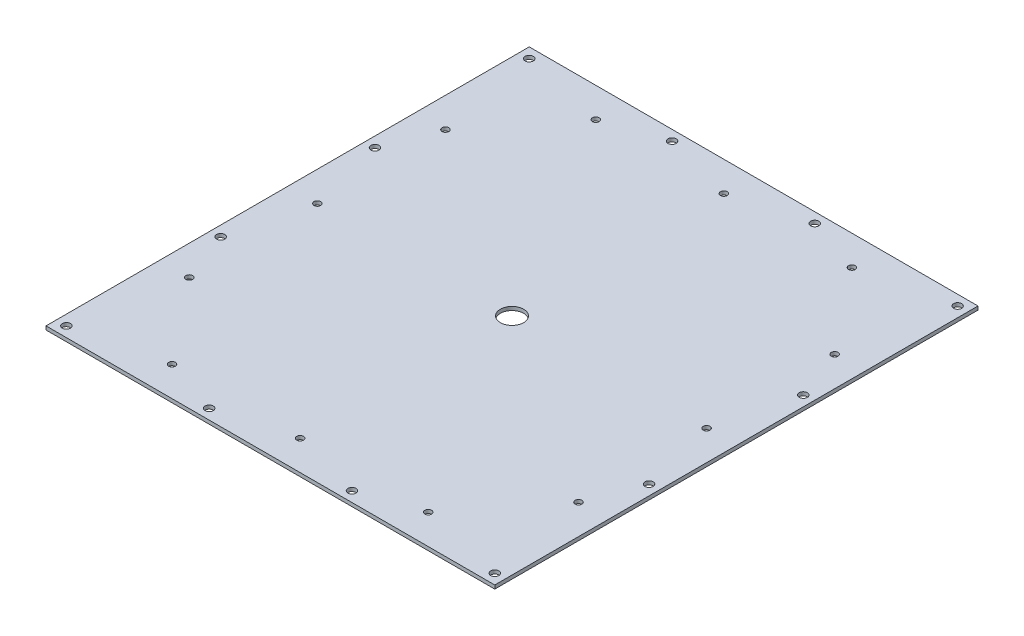
ISO-10303-21;
HEADER;
FILE_DESCRIPTION(('STEP AP214'),'2;1');
FILE_NAME('part.step','',(''),(''),'','','');
FILE_SCHEMA(('AUTOMOTIVE_DESIGN { 1 0 10303 214 1 1 1 1 }'));
ENDSEC;
DATA;
#1=APPLICATION_CONTEXT('core data for automotive mechanical design processes');
#2=APPLICATION_PROTOCOL_DEFINITION('international standard','automotive_design',2000,#1);
#3=PRODUCT_CONTEXT('',#1,'mechanical');
#4=PRODUCT('Part','Part','',(#3));
#5=PRODUCT_RELATED_PRODUCT_CATEGORY('part','',(#4));
#6=PRODUCT_DEFINITION_FORMATION('','',#4);
#7=PRODUCT_DEFINITION_CONTEXT('part definition',#1,'design');
#8=PRODUCT_DEFINITION('design','',#6,#7);
#9=PRODUCT_DEFINITION_SHAPE('','',#8);
#10=(LENGTH_UNIT() NAMED_UNIT(*) SI_UNIT(.MILLI.,.METRE.));
#11=(NAMED_UNIT(*) PLANE_ANGLE_UNIT() SI_UNIT($,.RADIAN.));
#12=(NAMED_UNIT(*) SI_UNIT($,.STERADIAN.) SOLID_ANGLE_UNIT());
#13=UNCERTAINTY_MEASURE_WITH_UNIT(LENGTH_MEASURE(1.E-05),#10,'distance_accuracy_value','');
#14=(GEOMETRIC_REPRESENTATION_CONTEXT(3) GLOBAL_UNCERTAINTY_ASSIGNED_CONTEXT((#13)) GLOBAL_UNIT_ASSIGNED_CONTEXT((#10,
#11,#12)) REPRESENTATION_CONTEXT('',''));
#15=CARTESIAN_POINT('',(0.,0.,0.));
#16=DIRECTION('',(0.,0.,1.));
#17=DIRECTION('',(1.,0.,0.));
#18=AXIS2_PLACEMENT_3D('',#15,#16,#17);
#19=CARTESIAN_POINT('',(0.,1.5748,0.));
#20=DIRECTION('',(0.,1.,0.));
#21=DIRECTION('',(0.,0.,1.));
#22=AXIS2_PLACEMENT_3D('',#19,#20,#21);
#23=PLANE('',#22);
#24=CARTESIAN_POINT('',(173.8884,1.5748,-152.4));
#25=DIRECTION('',(0.,1.,0.));
#26=DIRECTION('',(0.,0.,1.));
#27=AXIS2_PLACEMENT_3D('',#24,#25,#26);
#28=CIRCLE('',#27,1.47320000000001);
#29=CARTESIAN_POINT('',(173.8884,1.5748,-150.9268));
#30=VERTEX_POINT('',#29);
#31=EDGE_CURVE('E254',#30,#30,#28,.T.);
#32=ORIENTED_EDGE('',*,*,#31,.F.);
#33=EDGE_LOOP('',(#32));
#34=FACE_BOUND('',#33,.T.);
#35=CARTESIAN_POINT('',(173.8884,1.5748,-40.64));
#36=DIRECTION('',(0.,1.,0.));
#37=DIRECTION('',(0.,0.,1.));
#38=AXIS2_PLACEMENT_3D('',#35,#36,#37);
#39=CIRCLE('',#38,1.47320000000001);
#40=CARTESIAN_POINT('',(173.8884,1.5748,-39.1668));
#41=VERTEX_POINT('',#40);
#42=EDGE_CURVE('E242',#41,#41,#39,.T.);
#43=ORIENTED_EDGE('',*,*,#42,.F.);
#44=EDGE_LOOP('',(#43));
#45=FACE_BOUND('',#44,.T.);
#46=CARTESIAN_POINT('',(4.0894,1.5748,-96.52));
#47=DIRECTION('',(0.,1.,0.));
#48=DIRECTION('',(0.,0.,1.));
#49=AXIS2_PLACEMENT_3D('',#46,#47,#48);
#50=CIRCLE('',#49,1.4732);
#51=CARTESIAN_POINT('',(4.0894,1.5748,-95.0468));
#52=VERTEX_POINT('',#51);
#53=EDGE_CURVE('E230',#52,#52,#50,.T.);
#54=ORIENTED_EDGE('',*,*,#53,.F.);
#55=EDGE_LOOP('',(#54));
#56=FACE_BOUND('',#55,.T.);
#57=CARTESIAN_POINT('',(144.8816,1.5748,-188.9506));
#58=DIRECTION('',(0.,1.,0.));
#59=DIRECTION('',(0.,0.,1.));
#60=AXIS2_PLACEMENT_3D('',#57,#58,#59);
#61=CIRCLE('',#60,1.47320000000001);
#62=CARTESIAN_POINT('',(144.8816,1.5748,-187.4774));
#63=VERTEX_POINT('',#62);
#64=EDGE_CURVE('E218',#63,#63,#61,.T.);
#65=ORIENTED_EDGE('',*,*,#64,.F.);
#66=EDGE_LOOP('',(#65));
#67=FACE_BOUND('',#66,.T.);
#68=CARTESIAN_POINT('',(33.1216,1.5748,-188.9506));
#69=DIRECTION('',(0.,1.,0.));
#70=DIRECTION('',(0.,0.,1.));
#71=AXIS2_PLACEMENT_3D('',#68,#69,#70);
#72=CIRCLE('',#71,1.4732);
#73=CARTESIAN_POINT('',(33.1216,1.5748,-187.4774));
#74=VERTEX_POINT('',#73);
#75=EDGE_CURVE('E206',#74,#74,#72,.T.);
#76=ORIENTED_EDGE('',*,*,#75,.F.);
#77=EDGE_LOOP('',(#76));
#78=FACE_BOUND('',#77,.T.);
#79=CARTESIAN_POINT('',(89.0016,1.5748,-4.0894));
#80=DIRECTION('',(0.,1.,0.));
#81=DIRECTION('',(0.,0.,1.));
#82=AXIS2_PLACEMENT_3D('',#79,#80,#81);
#83=CIRCLE('',#82,1.47319999999999);
#84=CARTESIAN_POINT('',(89.0016,1.5748,-2.61620000000001));
#85=VERTEX_POINT('',#84);
#86=EDGE_CURVE('E194',#85,#85,#83,.T.);
#87=ORIENTED_EDGE('',*,*,#86,.F.);
#88=EDGE_LOOP('',(#87));
#89=FACE_BOUND('',#88,.T.);
#90=CARTESIAN_POINT('',(182.4482,1.5748,-130.175));
#91=DIRECTION('',(0.,1.,0.));
#92=DIRECTION('',(0.,0.,1.));
#93=AXIS2_PLACEMENT_3D('',#90,#91,#92);
#94=CIRCLE('',#93,1.778);
#95=CARTESIAN_POINT('',(182.4482,1.5748,-128.397));
#96=VERTEX_POINT('',#95);
#97=EDGE_CURVE('E182',#96,#96,#94,.T.);
#98=ORIENTED_EDGE('',*,*,#97,.F.);
#99=EDGE_LOOP('',(#98));
#100=FACE_BOUND('',#99,.T.);
#101=CARTESIAN_POINT('',(182.4482,1.5748,-197.485));
#102=DIRECTION('',(0.,1.,0.));
#103=DIRECTION('',(0.,0.,1.));
#104=AXIS2_PLACEMENT_3D('',#101,#102,#103);
#105=CIRCLE('',#104,1.778);
#106=CARTESIAN_POINT('',(182.4482,1.5748,-195.707));
#107=VERTEX_POINT('',#106);
#108=EDGE_CURVE('E170',#107,#107,#105,.T.);
#109=ORIENTED_EDGE('',*,*,#108,.F.);
#110=EDGE_LOOP('',(#109));
#111=FACE_BOUND('',#110,.T.);
#112=CARTESIAN_POINT('',(120.142,1.5748,4.445));
#113=DIRECTION('',(0.,1.,0.));
#114=DIRECTION('',(0.,0.,1.));
#115=AXIS2_PLACEMENT_3D('',#112,#113,#114);
#116=CIRCLE('',#115,1.778);
#117=CARTESIAN_POINT('',(120.142,1.5748,6.223));
#118=VERTEX_POINT('',#117);
#119=EDGE_CURVE('E158',#118,#118,#116,.T.);
#120=ORIENTED_EDGE('',*,*,#119,.F.);
#121=EDGE_LOOP('',(#120));
#122=FACE_BOUND('',#121,.T.);
#123=CARTESIAN_POINT('',(120.142,1.5748,-197.485));
#124=DIRECTION('',(0.,1.,0.));
#125=DIRECTION('',(0.,0.,1.));
#126=AXIS2_PLACEMENT_3D('',#123,#124,#125);
#127=CIRCLE('',#126,1.778);
#128=CARTESIAN_POINT('',(120.142,1.5748,-195.707));
#129=VERTEX_POINT('',#128);
#130=EDGE_CURVE('E146',#129,#129,#127,.T.);
#131=ORIENTED_EDGE('',*,*,#130,.F.);
#132=EDGE_LOOP('',(#131));
#133=FACE_BOUND('',#132,.T.);
#134=CARTESIAN_POINT('',(-4.445,1.5748,-130.175));
#135=DIRECTION('',(0.,1.,0.));
#136=DIRECTION('',(0.,0.,1.));
#137=AXIS2_PLACEMENT_3D('',#134,#135,#136);
#138=CIRCLE('',#137,1.778);
#139=CARTESIAN_POINT('',(-4.445,1.5748,-128.397));
#140=VERTEX_POINT('',#139);
#141=EDGE_CURVE('E133',#140,#140,#138,.T.);
#142=ORIENTED_EDGE('',*,*,#141,.F.);
#143=EDGE_LOOP('',(#142));
#144=FACE_BOUND('',#143,.T.);
#145=CARTESIAN_POINT('',(-4.445,1.5748,-197.485));
#146=DIRECTION('',(0.,1.,0.));
#147=DIRECTION('',(0.,0.,1.));
#148=AXIS2_PLACEMENT_3D('',#145,#146,#147);
#149=CIRCLE('',#148,1.778);
#150=CARTESIAN_POINT('',(-4.445,1.5748,-195.707));
#151=VERTEX_POINT('',#150);
#152=EDGE_CURVE('E121',#151,#151,#149,.T.);
#153=ORIENTED_EDGE('',*,*,#152,.F.);
#154=EDGE_LOOP('',(#153));
#155=FACE_BOUND('',#154,.T.);
#156=DIRECTION('',(0.,0.,1.));
#157=VECTOR('',#156,1.);
#158=CARTESIAN_POINT('',(-8.89,1.5748,-201.93));
#159=LINE('',#158,#157);
#160=CARTESIAN_POINT('',(-8.89,1.5748,-201.93));
#161=VERTEX_POINT('',#160);
#162=CARTESIAN_POINT('',(-8.89,1.5748,8.89));
#163=VERTEX_POINT('',#162);
#164=EDGE_CURVE('E88',#161,#163,#159,.T.);
#165=ORIENTED_EDGE('',*,*,#164,.T.);
#166=DIRECTION('',(1.,0.,0.));
#167=VECTOR('',#166,1.);
#168=CARTESIAN_POINT('',(-8.89,1.5748,8.89));
#169=LINE('',#168,#167);
#170=CARTESIAN_POINT('',(186.8932,1.5748,8.89));
#171=VERTEX_POINT('',#170);
#172=EDGE_CURVE('E83',#163,#171,#169,.T.);
#173=ORIENTED_EDGE('',*,*,#172,.T.);
#174=DIRECTION('',(0.,0.,-1.));
#175=VECTOR('',#174,1.);
#176=CARTESIAN_POINT('',(186.8932,1.5748,8.89));
#177=LINE('',#176,#175);
#178=CARTESIAN_POINT('',(186.8932,1.5748,-201.93));
#179=VERTEX_POINT('',#178);
#180=EDGE_CURVE('E86',#171,#179,#177,.T.);
#181=ORIENTED_EDGE('',*,*,#180,.T.);
#182=DIRECTION('',(-1.,0.,0.));
#183=VECTOR('',#182,1.);
#184=CARTESIAN_POINT('',(186.8932,1.5748,-201.93));
#185=LINE('',#184,#183);
#186=EDGE_CURVE('E53',#179,#161,#185,.T.);
#187=ORIENTED_EDGE('',*,*,#186,.T.);
#188=EDGE_LOOP('',(#165,#173,#181,#187));
#189=FACE_BOUND('',#188,.T.);
#190=CARTESIAN_POINT('',(-4.445,1.5748,4.445));
#191=DIRECTION('',(0.,1.,0.));
#192=DIRECTION('',(0.,0.,1.));
#193=AXIS2_PLACEMENT_3D('',#190,#191,#192);
#194=CIRCLE('',#193,1.778);
#195=CARTESIAN_POINT('',(-4.445,1.5748,6.223));
#196=VERTEX_POINT('',#195);
#197=EDGE_CURVE('E104',#196,#196,#194,.T.);
#198=ORIENTED_EDGE('',*,*,#197,.F.);
#199=EDGE_LOOP('',(#198));
#200=FACE_BOUND('',#199,.T.);
#201=CARTESIAN_POINT('',(-4.445,1.5748,-62.865));
#202=DIRECTION('',(0.,1.,0.));
#203=DIRECTION('',(0.,0.,1.));
#204=AXIS2_PLACEMENT_3D('',#201,#202,#203);
#205=CIRCLE('',#204,1.778);
#206=CARTESIAN_POINT('',(-4.445,1.5748,-61.087));
#207=VERTEX_POINT('',#206);
#208=EDGE_CURVE('E127',#207,#207,#205,.T.);
#209=ORIENTED_EDGE('',*,*,#208,.F.);
#210=EDGE_LOOP('',(#209));
#211=FACE_BOUND('',#210,.T.);
#212=CARTESIAN_POINT('',(57.8612,1.5748,-197.485));
#213=DIRECTION('',(0.,1.,0.));
#214=DIRECTION('',(0.,0.,1.));
#215=AXIS2_PLACEMENT_3D('',#212,#213,#214);
#216=CIRCLE('',#215,1.778);
#217=CARTESIAN_POINT('',(57.8612,1.5748,-195.707));
#218=VERTEX_POINT('',#217);
#219=EDGE_CURVE('E140',#218,#218,#216,.T.);
#220=ORIENTED_EDGE('',*,*,#219,.F.);
#221=EDGE_LOOP('',(#220));
#222=FACE_BOUND('',#221,.T.);
#223=CARTESIAN_POINT('',(57.8612,1.5748,4.445));
#224=DIRECTION('',(0.,1.,0.));
#225=DIRECTION('',(0.,0.,1.));
#226=AXIS2_PLACEMENT_3D('',#223,#224,#225);
#227=CIRCLE('',#226,1.778);
#228=CARTESIAN_POINT('',(57.8612,1.5748,6.223));
#229=VERTEX_POINT('',#228);
#230=EDGE_CURVE('E152',#229,#229,#227,.T.);
#231=ORIENTED_EDGE('',*,*,#230,.F.);
#232=EDGE_LOOP('',(#231));
#233=FACE_BOUND('',#232,.T.);
#234=CARTESIAN_POINT('',(182.4482,1.5748,4.445));
#235=DIRECTION('',(0.,1.,0.));
#236=DIRECTION('',(0.,0.,1.));
#237=AXIS2_PLACEMENT_3D('',#234,#235,#236);
#238=CIRCLE('',#237,1.778);
#239=CARTESIAN_POINT('',(182.4482,1.5748,6.223));
#240=VERTEX_POINT('',#239);
#241=EDGE_CURVE('E164',#240,#240,#238,.T.);
#242=ORIENTED_EDGE('',*,*,#241,.F.);
#243=EDGE_LOOP('',(#242));
#244=FACE_BOUND('',#243,.T.);
#245=CARTESIAN_POINT('',(182.4482,1.5748,-62.865));
#246=DIRECTION('',(0.,1.,0.));
#247=DIRECTION('',(0.,0.,1.));
#248=AXIS2_PLACEMENT_3D('',#245,#246,#247);
#249=CIRCLE('',#248,1.778);
#250=CARTESIAN_POINT('',(182.4482,1.5748,-61.087));
#251=VERTEX_POINT('',#250);
#252=EDGE_CURVE('E176',#251,#251,#249,.T.);
#253=ORIENTED_EDGE('',*,*,#252,.F.);
#254=EDGE_LOOP('',(#253));
#255=FACE_BOUND('',#254,.T.);
#256=CARTESIAN_POINT('',(33.1216,1.5748,-4.0894));
#257=DIRECTION('',(0.,1.,0.));
#258=DIRECTION('',(0.,0.,1.));
#259=AXIS2_PLACEMENT_3D('',#256,#257,#258);
#260=CIRCLE('',#259,1.4732);
#261=CARTESIAN_POINT('',(33.1216,1.5748,-2.6162));
#262=VERTEX_POINT('',#261);
#263=EDGE_CURVE('E188',#262,#262,#260,.T.);
#264=ORIENTED_EDGE('',*,*,#263,.F.);
#265=EDGE_LOOP('',(#264));
#266=FACE_BOUND('',#265,.T.);
#267=CARTESIAN_POINT('',(144.8816,1.5748,-4.0894));
#268=DIRECTION('',(0.,1.,0.));
#269=DIRECTION('',(0.,0.,1.));
#270=AXIS2_PLACEMENT_3D('',#267,#268,#269);
#271=CIRCLE('',#270,1.47320000000001);
#272=CARTESIAN_POINT('',(144.8816,1.5748,-2.61619999999999));
#273=VERTEX_POINT('',#272);
#274=EDGE_CURVE('E200',#273,#273,#271,.T.);
#275=ORIENTED_EDGE('',*,*,#274,.F.);
#276=EDGE_LOOP('',(#275));
#277=FACE_BOUND('',#276,.T.);
#278=CARTESIAN_POINT('',(89.0016,1.5748,-188.9506));
#279=DIRECTION('',(0.,1.,0.));
#280=DIRECTION('',(0.,0.,1.));
#281=AXIS2_PLACEMENT_3D('',#278,#279,#280);
#282=CIRCLE('',#281,1.47319999999999);
#283=CARTESIAN_POINT('',(89.0016,1.5748,-187.4774));
#284=VERTEX_POINT('',#283);
#285=EDGE_CURVE('E212',#284,#284,#282,.T.);
#286=ORIENTED_EDGE('',*,*,#285,.F.);
#287=EDGE_LOOP('',(#286));
#288=FACE_BOUND('',#287,.T.);
#289=CARTESIAN_POINT('',(4.0894,1.5748,-40.64));
#290=DIRECTION('',(0.,1.,0.));
#291=DIRECTION('',(0.,0.,1.));
#292=AXIS2_PLACEMENT_3D('',#289,#290,#291);
#293=CIRCLE('',#292,1.4732);
#294=CARTESIAN_POINT('',(4.0894,1.5748,-39.1668));
#295=VERTEX_POINT('',#294);
#296=EDGE_CURVE('E224',#295,#295,#293,.T.);
#297=ORIENTED_EDGE('',*,*,#296,.F.);
#298=EDGE_LOOP('',(#297));
#299=FACE_BOUND('',#298,.T.);
#300=CARTESIAN_POINT('',(4.0894,1.5748,-152.4));
#301=DIRECTION('',(0.,1.,0.));
#302=DIRECTION('',(0.,0.,1.));
#303=AXIS2_PLACEMENT_3D('',#300,#301,#302);
#304=CIRCLE('',#303,1.4732);
#305=CARTESIAN_POINT('',(4.0894,1.5748,-150.9268));
#306=VERTEX_POINT('',#305);
#307=EDGE_CURVE('E236',#306,#306,#304,.T.);
#308=ORIENTED_EDGE('',*,*,#307,.F.);
#309=EDGE_LOOP('',(#308));
#310=FACE_BOUND('',#309,.T.);
#311=CARTESIAN_POINT('',(173.8884,1.5748,-96.52));
#312=DIRECTION('',(0.,1.,0.));
#313=DIRECTION('',(0.,0.,1.));
#314=AXIS2_PLACEMENT_3D('',#311,#312,#313);
#315=CIRCLE('',#314,1.47320000000001);
#316=CARTESIAN_POINT('',(173.8884,1.5748,-95.0468));
#317=VERTEX_POINT('',#316);
#318=EDGE_CURVE('E248',#317,#317,#315,.T.);
#319=ORIENTED_EDGE('',*,*,#318,.F.);
#320=EDGE_LOOP('',(#319));
#321=FACE_BOUND('',#320,.T.);
#322=CARTESIAN_POINT('',(89.0016,1.5748,-96.52));
#323=DIRECTION('',(0.,1.,0.));
#324=DIRECTION('',(0.,0.,1.));
#325=AXIS2_PLACEMENT_3D('',#322,#323,#324);
#326=CIRCLE('',#325,5.08);
#327=CARTESIAN_POINT('',(89.0016,1.5748,-91.44));
#328=VERTEX_POINT('',#327);
#329=EDGE_CURVE('E260',#328,#328,#326,.T.);
#330=ORIENTED_EDGE('',*,*,#329,.F.);
#331=EDGE_LOOP('',(#330));
#332=FACE_BOUND('',#331,.T.);
#333=ADVANCED_FACE('F36',(#34,#45,#56,#67,#78,#89,#100,#111,#122,#133,#144,#155,#189,#200,#211,
#222,#233,#244,#255,#266,#277,#288,#299,#310,#321,#332),#23,.T.);
#334=CARTESIAN_POINT('',(0.,0.,0.));
#335=DIRECTION('',(0.,1.,0.));
#336=DIRECTION('',(0.,0.,1.));
#337=AXIS2_PLACEMENT_3D('',#334,#335,#336);
#338=PLANE('',#337);
#339=DIRECTION('',(0.,0.,1.));
#340=VECTOR('',#339,1.);
#341=CARTESIAN_POINT('',(-8.89,0.,-201.93));
#342=LINE('',#341,#340);
#343=CARTESIAN_POINT('',(-8.89,0.,-201.93));
#344=VERTEX_POINT('',#343);
#345=CARTESIAN_POINT('',(-8.89,0.,8.89));
#346=VERTEX_POINT('',#345);
#347=EDGE_CURVE('E100',#344,#346,#342,.T.);
#348=ORIENTED_EDGE('',*,*,#347,.F.);
#349=DIRECTION('',(-1.,0.,0.));
#350=VECTOR('',#349,1.);
#351=CARTESIAN_POINT('',(186.8932,0.,-201.93));
#352=LINE('',#351,#350);
#353=CARTESIAN_POINT('',(186.8932,0.,-201.93));
#354=VERTEX_POINT('',#353);
#355=EDGE_CURVE('E76',#354,#344,#352,.T.);
#356=ORIENTED_EDGE('',*,*,#355,.F.);
#357=DIRECTION('',(0.,0.,-1.));
#358=VECTOR('',#357,1.);
#359=CARTESIAN_POINT('',(186.8932,0.,8.89));
#360=LINE('',#359,#358);
#361=CARTESIAN_POINT('',(186.8932,0.,8.89));
#362=VERTEX_POINT('',#361);
#363=EDGE_CURVE('E70',#362,#354,#360,.T.);
#364=ORIENTED_EDGE('',*,*,#363,.F.);
#365=DIRECTION('',(1.,0.,0.));
#366=VECTOR('',#365,1.);
#367=CARTESIAN_POINT('',(-8.89,0.,8.89));
#368=LINE('',#367,#366);
#369=EDGE_CURVE('E92',#346,#362,#368,.T.);
#370=ORIENTED_EDGE('',*,*,#369,.F.);
#371=EDGE_LOOP('',(#348,#356,#364,#370));
#372=FACE_BOUND('',#371,.T.);
#373=CARTESIAN_POINT('',(-4.445,0.,4.445));
#374=DIRECTION('',(0.,1.,0.));
#375=DIRECTION('',(0.,0.,1.));
#376=AXIS2_PLACEMENT_3D('',#373,#374,#375);
#377=CIRCLE('',#376,1.778);
#378=CARTESIAN_POINT('',(-4.445,0.,6.223));
#379=VERTEX_POINT('',#378);
#380=EDGE_CURVE('E118',#379,#379,#377,.T.);
#381=ORIENTED_EDGE('',*,*,#380,.T.);
#382=EDGE_LOOP('',(#381));
#383=FACE_BOUND('',#382,.T.);
#384=CARTESIAN_POINT('',(-4.445,0.,-197.485));
#385=DIRECTION('',(0.,1.,0.));
#386=DIRECTION('',(0.,0.,1.));
#387=AXIS2_PLACEMENT_3D('',#384,#385,#386);
#388=CIRCLE('',#387,1.778);
#389=CARTESIAN_POINT('',(-4.445,0.,-195.707));
#390=VERTEX_POINT('',#389);
#391=EDGE_CURVE('E124',#390,#390,#388,.T.);
#392=ORIENTED_EDGE('',*,*,#391,.T.);
#393=EDGE_LOOP('',(#392));
#394=FACE_BOUND('',#393,.T.);
#395=CARTESIAN_POINT('',(-4.445,0.,-62.865));
#396=DIRECTION('',(0.,1.,0.));
#397=DIRECTION('',(0.,0.,1.));
#398=AXIS2_PLACEMENT_3D('',#395,#396,#397);
#399=CIRCLE('',#398,1.778);
#400=CARTESIAN_POINT('',(-4.445,0.,-61.087));
#401=VERTEX_POINT('',#400);
#402=EDGE_CURVE('E130',#401,#401,#399,.T.);
#403=ORIENTED_EDGE('',*,*,#402,.T.);
#404=EDGE_LOOP('',(#403));
#405=FACE_BOUND('',#404,.T.);
#406=CARTESIAN_POINT('',(-4.445,0.,-130.175));
#407=DIRECTION('',(0.,1.,0.));
#408=DIRECTION('',(0.,0.,1.));
#409=AXIS2_PLACEMENT_3D('',#406,#407,#408);
#410=CIRCLE('',#409,1.778);
#411=CARTESIAN_POINT('',(-4.445,0.,-128.397));
#412=VERTEX_POINT('',#411);
#413=EDGE_CURVE('E137',#412,#412,#410,.T.);
#414=ORIENTED_EDGE('',*,*,#413,.T.);
#415=EDGE_LOOP('',(#414));
#416=FACE_BOUND('',#415,.T.);
#417=CARTESIAN_POINT('',(57.8612,0.,-197.485));
#418=DIRECTION('',(0.,1.,0.));
#419=DIRECTION('',(0.,0.,1.));
#420=AXIS2_PLACEMENT_3D('',#417,#418,#419);
#421=CIRCLE('',#420,1.778);
#422=CARTESIAN_POINT('',(57.8612,0.,-195.707));
#423=VERTEX_POINT('',#422);
#424=EDGE_CURVE('E143',#423,#423,#421,.T.);
#425=ORIENTED_EDGE('',*,*,#424,.T.);
#426=EDGE_LOOP('',(#425));
#427=FACE_BOUND('',#426,.T.);
#428=CARTESIAN_POINT('',(120.142,0.,-197.485));
#429=DIRECTION('',(0.,1.,0.));
#430=DIRECTION('',(0.,0.,1.));
#431=AXIS2_PLACEMENT_3D('',#428,#429,#430);
#432=CIRCLE('',#431,1.778);
#433=CARTESIAN_POINT('',(120.142,0.,-195.707));
#434=VERTEX_POINT('',#433);
#435=EDGE_CURVE('E149',#434,#434,#432,.T.);
#436=ORIENTED_EDGE('',*,*,#435,.T.);
#437=EDGE_LOOP('',(#436));
#438=FACE_BOUND('',#437,.T.);
#439=CARTESIAN_POINT('',(57.8612,0.,4.445));
#440=DIRECTION('',(0.,1.,0.));
#441=DIRECTION('',(0.,0.,1.));
#442=AXIS2_PLACEMENT_3D('',#439,#440,#441);
#443=CIRCLE('',#442,1.778);
#444=CARTESIAN_POINT('',(57.8612,0.,6.223));
#445=VERTEX_POINT('',#444);
#446=EDGE_CURVE('E155',#445,#445,#443,.T.);
#447=ORIENTED_EDGE('',*,*,#446,.T.);
#448=EDGE_LOOP('',(#447));
#449=FACE_BOUND('',#448,.T.);
#450=CARTESIAN_POINT('',(120.142,0.,4.445));
#451=DIRECTION('',(0.,1.,0.));
#452=DIRECTION('',(0.,0.,1.));
#453=AXIS2_PLACEMENT_3D('',#450,#451,#452);
#454=CIRCLE('',#453,1.778);
#455=CARTESIAN_POINT('',(120.142,0.,6.223));
#456=VERTEX_POINT('',#455);
#457=EDGE_CURVE('E161',#456,#456,#454,.T.);
#458=ORIENTED_EDGE('',*,*,#457,.T.);
#459=EDGE_LOOP('',(#458));
#460=FACE_BOUND('',#459,.T.);
#461=CARTESIAN_POINT('',(182.4482,0.,4.445));
#462=DIRECTION('',(0.,1.,0.));
#463=DIRECTION('',(0.,0.,1.));
#464=AXIS2_PLACEMENT_3D('',#461,#462,#463);
#465=CIRCLE('',#464,1.778);
#466=CARTESIAN_POINT('',(182.4482,0.,6.223));
#467=VERTEX_POINT('',#466);
#468=EDGE_CURVE('E167',#467,#467,#465,.T.);
#469=ORIENTED_EDGE('',*,*,#468,.T.);
#470=EDGE_LOOP('',(#469));
#471=FACE_BOUND('',#470,.T.);
#472=CARTESIAN_POINT('',(182.4482,0.,-197.485));
#473=DIRECTION('',(0.,1.,0.));
#474=DIRECTION('',(0.,0.,1.));
#475=AXIS2_PLACEMENT_3D('',#472,#473,#474);
#476=CIRCLE('',#475,1.778);
#477=CARTESIAN_POINT('',(182.4482,0.,-195.707));
#478=VERTEX_POINT('',#477);
#479=EDGE_CURVE('E173',#478,#478,#476,.T.);
#480=ORIENTED_EDGE('',*,*,#479,.T.);
#481=EDGE_LOOP('',(#480));
#482=FACE_BOUND('',#481,.T.);
#483=CARTESIAN_POINT('',(182.4482,0.,-62.865));
#484=DIRECTION('',(0.,1.,0.));
#485=DIRECTION('',(0.,0.,1.));
#486=AXIS2_PLACEMENT_3D('',#483,#484,#485);
#487=CIRCLE('',#486,1.778);
#488=CARTESIAN_POINT('',(182.4482,0.,-61.087));
#489=VERTEX_POINT('',#488);
#490=EDGE_CURVE('E179',#489,#489,#487,.T.);
#491=ORIENTED_EDGE('',*,*,#490,.T.);
#492=EDGE_LOOP('',(#491));
#493=FACE_BOUND('',#492,.T.);
#494=CARTESIAN_POINT('',(182.4482,0.,-130.175));
#495=DIRECTION('',(0.,1.,0.));
#496=DIRECTION('',(0.,0.,1.));
#497=AXIS2_PLACEMENT_3D('',#494,#495,#496);
#498=CIRCLE('',#497,1.778);
#499=CARTESIAN_POINT('',(182.4482,0.,-128.397));
#500=VERTEX_POINT('',#499);
#501=EDGE_CURVE('E185',#500,#500,#498,.T.);
#502=ORIENTED_EDGE('',*,*,#501,.T.);
#503=EDGE_LOOP('',(#502));
#504=FACE_BOUND('',#503,.T.);
#505=CARTESIAN_POINT('',(33.1216,0.,-4.0894));
#506=DIRECTION('',(0.,1.,0.));
#507=DIRECTION('',(0.,0.,1.));
#508=AXIS2_PLACEMENT_3D('',#505,#506,#507);
#509=CIRCLE('',#508,1.4732);
#510=CARTESIAN_POINT('',(33.1216,0.,-2.6162));
#511=VERTEX_POINT('',#510);
#512=EDGE_CURVE('E191',#511,#511,#509,.T.);
#513=ORIENTED_EDGE('',*,*,#512,.T.);
#514=EDGE_LOOP('',(#513));
#515=FACE_BOUND('',#514,.T.);
#516=CARTESIAN_POINT('',(89.0016,0.,-4.0894));
#517=DIRECTION('',(0.,1.,0.));
#518=DIRECTION('',(0.,0.,1.));
#519=AXIS2_PLACEMENT_3D('',#516,#517,#518);
#520=CIRCLE('',#519,1.47319999999999);
#521=CARTESIAN_POINT('',(89.0016,0.,-2.61620000000001));
#522=VERTEX_POINT('',#521);
#523=EDGE_CURVE('E197',#522,#522,#520,.T.);
#524=ORIENTED_EDGE('',*,*,#523,.T.);
#525=EDGE_LOOP('',(#524));
#526=FACE_BOUND('',#525,.T.);
#527=CARTESIAN_POINT('',(144.8816,0.,-4.0894));
#528=DIRECTION('',(0.,1.,0.));
#529=DIRECTION('',(0.,0.,1.));
#530=AXIS2_PLACEMENT_3D('',#527,#528,#529);
#531=CIRCLE('',#530,1.47320000000001);
#532=CARTESIAN_POINT('',(144.8816,0.,-2.61619999999999));
#533=VERTEX_POINT('',#532);
#534=EDGE_CURVE('E203',#533,#533,#531,.T.);
#535=ORIENTED_EDGE('',*,*,#534,.T.);
#536=EDGE_LOOP('',(#535));
#537=FACE_BOUND('',#536,.T.);
#538=CARTESIAN_POINT('',(33.1216,0.,-188.9506));
#539=DIRECTION('',(0.,1.,0.));
#540=DIRECTION('',(0.,0.,1.));
#541=AXIS2_PLACEMENT_3D('',#538,#539,#540);
#542=CIRCLE('',#541,1.4732);
#543=CARTESIAN_POINT('',(33.1216,0.,-187.4774));
#544=VERTEX_POINT('',#543);
#545=EDGE_CURVE('E209',#544,#544,#542,.T.);
#546=ORIENTED_EDGE('',*,*,#545,.T.);
#547=EDGE_LOOP('',(#546));
#548=FACE_BOUND('',#547,.T.);
#549=CARTESIAN_POINT('',(89.0016,0.,-188.9506));
#550=DIRECTION('',(0.,1.,0.));
#551=DIRECTION('',(0.,0.,1.));
#552=AXIS2_PLACEMENT_3D('',#549,#550,#551);
#553=CIRCLE('',#552,1.47319999999999);
#554=CARTESIAN_POINT('',(89.0016,0.,-187.4774));
#555=VERTEX_POINT('',#554);
#556=EDGE_CURVE('E215',#555,#555,#553,.T.);
#557=ORIENTED_EDGE('',*,*,#556,.T.);
#558=EDGE_LOOP('',(#557));
#559=FACE_BOUND('',#558,.T.);
#560=CARTESIAN_POINT('',(144.8816,0.,-188.9506));
#561=DIRECTION('',(0.,1.,0.));
#562=DIRECTION('',(0.,0.,1.));
#563=AXIS2_PLACEMENT_3D('',#560,#561,#562);
#564=CIRCLE('',#563,1.47320000000001);
#565=CARTESIAN_POINT('',(144.8816,0.,-187.4774));
#566=VERTEX_POINT('',#565);
#567=EDGE_CURVE('E221',#566,#566,#564,.T.);
#568=ORIENTED_EDGE('',*,*,#567,.T.);
#569=EDGE_LOOP('',(#568));
#570=FACE_BOUND('',#569,.T.);
#571=CARTESIAN_POINT('',(4.0894,0.,-40.64));
#572=DIRECTION('',(0.,1.,0.));
#573=DIRECTION('',(0.,0.,1.));
#574=AXIS2_PLACEMENT_3D('',#571,#572,#573);
#575=CIRCLE('',#574,1.4732);
#576=CARTESIAN_POINT('',(4.0894,0.,-39.1668));
#577=VERTEX_POINT('',#576);
#578=EDGE_CURVE('E227',#577,#577,#575,.T.);
#579=ORIENTED_EDGE('',*,*,#578,.T.);
#580=EDGE_LOOP('',(#579));
#581=FACE_BOUND('',#580,.T.);
#582=CARTESIAN_POINT('',(4.0894,0.,-96.52));
#583=DIRECTION('',(0.,1.,0.));
#584=DIRECTION('',(0.,0.,1.));
#585=AXIS2_PLACEMENT_3D('',#582,#583,#584);
#586=CIRCLE('',#585,1.4732);
#587=CARTESIAN_POINT('',(4.0894,0.,-95.0468));
#588=VERTEX_POINT('',#587);
#589=EDGE_CURVE('E233',#588,#588,#586,.T.);
#590=ORIENTED_EDGE('',*,*,#589,.T.);
#591=EDGE_LOOP('',(#590));
#592=FACE_BOUND('',#591,.T.);
#593=CARTESIAN_POINT('',(4.0894,0.,-152.4));
#594=DIRECTION('',(0.,1.,0.));
#595=DIRECTION('',(0.,0.,1.));
#596=AXIS2_PLACEMENT_3D('',#593,#594,#595);
#597=CIRCLE('',#596,1.4732);
#598=CARTESIAN_POINT('',(4.0894,0.,-150.9268));
#599=VERTEX_POINT('',#598);
#600=EDGE_CURVE('E239',#599,#599,#597,.T.);
#601=ORIENTED_EDGE('',*,*,#600,.T.);
#602=EDGE_LOOP('',(#601));
#603=FACE_BOUND('',#602,.T.);
#604=CARTESIAN_POINT('',(173.8884,0.,-40.64));
#605=DIRECTION('',(0.,1.,0.));
#606=DIRECTION('',(0.,0.,1.));
#607=AXIS2_PLACEMENT_3D('',#604,#605,#606);
#608=CIRCLE('',#607,1.47320000000001);
#609=CARTESIAN_POINT('',(173.8884,0.,-39.1668));
#610=VERTEX_POINT('',#609);
#611=EDGE_CURVE('E245',#610,#610,#608,.T.);
#612=ORIENTED_EDGE('',*,*,#611,.T.);
#613=EDGE_LOOP('',(#612));
#614=FACE_BOUND('',#613,.T.);
#615=CARTESIAN_POINT('',(173.8884,0.,-96.52));
#616=DIRECTION('',(0.,1.,0.));
#617=DIRECTION('',(0.,0.,1.));
#618=AXIS2_PLACEMENT_3D('',#615,#616,#617);
#619=CIRCLE('',#618,1.47320000000001);
#620=CARTESIAN_POINT('',(173.8884,0.,-95.0468));
#621=VERTEX_POINT('',#620);
#622=EDGE_CURVE('E251',#621,#621,#619,.T.);
#623=ORIENTED_EDGE('',*,*,#622,.T.);
#624=EDGE_LOOP('',(#623));
#625=FACE_BOUND('',#624,.T.);
#626=CARTESIAN_POINT('',(173.8884,0.,-152.4));
#627=DIRECTION('',(0.,1.,0.));
#628=DIRECTION('',(0.,0.,1.));
#629=AXIS2_PLACEMENT_3D('',#626,#627,#628);
#630=CIRCLE('',#629,1.47320000000001);
#631=CARTESIAN_POINT('',(173.8884,0.,-150.9268));
#632=VERTEX_POINT('',#631);
#633=EDGE_CURVE('E257',#632,#632,#630,.T.);
#634=ORIENTED_EDGE('',*,*,#633,.T.);
#635=EDGE_LOOP('',(#634));
#636=FACE_BOUND('',#635,.T.);
#637=CARTESIAN_POINT('',(89.0016,0.,-96.52));
#638=DIRECTION('',(0.,1.,0.));
#639=DIRECTION('',(0.,0.,1.));
#640=AXIS2_PLACEMENT_3D('',#637,#638,#639);
#641=CIRCLE('',#640,5.08);
#642=CARTESIAN_POINT('',(89.0016,0.,-91.44));
#643=VERTEX_POINT('',#642);
#644=EDGE_CURVE('E263',#643,#643,#641,.T.);
#645=ORIENTED_EDGE('',*,*,#644,.T.);
#646=EDGE_LOOP('',(#645));
#647=FACE_BOUND('',#646,.T.);
#648=ADVANCED_FACE('F112',(#372,#383,#394,#405,#416,#427,#438,#449,#460,#471,#482,#493,#504,
#515,#526,#537,#548,#559,#570,#581,#592,#603,#614,#625,#636,#647),#338,.F.);
#649=CARTESIAN_POINT('',(-8.89,1.5748,-201.93));
#650=DIRECTION('',(1.,0.,0.));
#651=DIRECTION('',(0.,0.,-1.));
#652=AXIS2_PLACEMENT_3D('',#649,#650,#651);
#653=PLANE('',#652);
#654=ORIENTED_EDGE('',*,*,#347,.T.);
#655=DIRECTION('',(0.,-1.,0.));
#656=VECTOR('',#655,1.);
#657=CARTESIAN_POINT('',(-8.89,1.5748,8.89));
#658=LINE('',#657,#656);
#659=EDGE_CURVE('E11',#163,#346,#658,.T.);
#660=ORIENTED_EDGE('',*,*,#659,.F.);
#661=ORIENTED_EDGE('',*,*,#164,.F.);
#662=DIRECTION('',(0.,-1.,0.));
#663=VECTOR('',#662,1.);
#664=CARTESIAN_POINT('',(-8.89,1.5748,-201.93));
#665=LINE('',#664,#663);
#666=EDGE_CURVE('E96',#161,#344,#665,.T.);
#667=ORIENTED_EDGE('',*,*,#666,.T.);
#668=EDGE_LOOP('',(#654,#660,#661,#667));
#669=FACE_BOUND('',#668,.T.);
#670=ADVANCED_FACE('F38',(#669),#653,.F.);
#671=CARTESIAN_POINT('',(-8.89,1.5748,8.89));
#672=DIRECTION('',(0.,0.,-1.));
#673=DIRECTION('',(-1.,0.,0.));
#674=AXIS2_PLACEMENT_3D('',#671,#672,#673);
#675=PLANE('',#674);
#676=ORIENTED_EDGE('',*,*,#369,.T.);
#677=DIRECTION('',(0.,-1.,0.));
#678=VECTOR('',#677,1.);
#679=CARTESIAN_POINT('',(186.8932,1.5748,8.89));
#680=LINE('',#679,#678);
#681=EDGE_CURVE('E45',#171,#362,#680,.T.);
#682=ORIENTED_EDGE('',*,*,#681,.F.);
#683=ORIENTED_EDGE('',*,*,#172,.F.);
#684=ORIENTED_EDGE('',*,*,#659,.T.);
#685=EDGE_LOOP('',(#676,#682,#683,#684));
#686=FACE_BOUND('',#685,.T.);
#687=ADVANCED_FACE('F91',(#686),#675,.F.);
#688=CARTESIAN_POINT('',(186.8932,1.5748,8.89));
#689=DIRECTION('',(-1.,0.,0.));
#690=DIRECTION('',(0.,0.,1.));
#691=AXIS2_PLACEMENT_3D('',#688,#689,#690);
#692=PLANE('',#691);
#693=ORIENTED_EDGE('',*,*,#363,.T.);
#694=DIRECTION('',(0.,-1.,0.));
#695=VECTOR('',#694,1.);
#696=CARTESIAN_POINT('',(186.8932,1.5748,-201.93));
#697=LINE('',#696,#695);
#698=EDGE_CURVE('E93',#179,#354,#697,.T.);
#699=ORIENTED_EDGE('',*,*,#698,.F.);
#700=ORIENTED_EDGE('',*,*,#180,.F.);
#701=ORIENTED_EDGE('',*,*,#681,.T.);
#702=EDGE_LOOP('',(#693,#699,#700,#701));
#703=FACE_BOUND('',#702,.T.);
#704=ADVANCED_FACE('F94',(#703),#692,.F.);
#705=CARTESIAN_POINT('',(186.8932,1.5748,-201.93));
#706=DIRECTION('',(0.,0.,1.));
#707=DIRECTION('',(1.,0.,0.));
#708=AXIS2_PLACEMENT_3D('',#705,#706,#707);
#709=PLANE('',#708);
#710=ORIENTED_EDGE('',*,*,#355,.T.);
#711=ORIENTED_EDGE('',*,*,#666,.F.);
#712=ORIENTED_EDGE('',*,*,#186,.F.);
#713=ORIENTED_EDGE('',*,*,#698,.T.);
#714=EDGE_LOOP('',(#710,#711,#712,#713));
#715=FACE_BOUND('',#714,.T.);
#716=ADVANCED_FACE('F109',(#715),#709,.F.);
#717=CARTESIAN_POINT('',(-4.445,1.5748,4.445));
#718=DIRECTION('',(0.,-1.,0.));
#719=DIRECTION('',(0.,0.,-1.));
#720=AXIS2_PLACEMENT_3D('',#717,#718,#719);
#721=CYLINDRICAL_SURFACE('',#720,1.778);
#722=ORIENTED_EDGE('',*,*,#197,.T.);
#723=EDGE_LOOP('',(#722));
#724=FACE_BOUND('',#723,.T.);
#725=ORIENTED_EDGE('',*,*,#380,.F.);
#726=EDGE_LOOP('',(#725));
#727=FACE_BOUND('',#726,.T.);
#728=ADVANCED_FACE('F284',(#724,#727),#721,.F.);
#729=CARTESIAN_POINT('',(-4.445,1.5748,-197.485));
#730=DIRECTION('',(0.,-1.,0.));
#731=DIRECTION('',(0.,0.,-1.));
#732=AXIS2_PLACEMENT_3D('',#729,#730,#731);
#733=CYLINDRICAL_SURFACE('',#732,1.778);
#734=ORIENTED_EDGE('',*,*,#152,.T.);
#735=EDGE_LOOP('',(#734));
#736=FACE_BOUND('',#735,.T.);
#737=ORIENTED_EDGE('',*,*,#391,.F.);
#738=EDGE_LOOP('',(#737));
#739=FACE_BOUND('',#738,.T.);
#740=ADVANCED_FACE('F332',(#736,#739),#733,.F.);
#741=CARTESIAN_POINT('',(-4.445,1.5748,-62.865));
#742=DIRECTION('',(0.,-1.,0.));
#743=DIRECTION('',(0.,0.,-1.));
#744=AXIS2_PLACEMENT_3D('',#741,#742,#743);
#745=CYLINDRICAL_SURFACE('',#744,1.778);
#746=ORIENTED_EDGE('',*,*,#208,.T.);
#747=EDGE_LOOP('',(#746));
#748=FACE_BOUND('',#747,.T.);
#749=ORIENTED_EDGE('',*,*,#402,.F.);
#750=EDGE_LOOP('',(#749));
#751=FACE_BOUND('',#750,.T.);
#752=ADVANCED_FACE('F340',(#748,#751),#745,.F.);
#753=CARTESIAN_POINT('',(-4.445,1.5748,-130.175));
#754=DIRECTION('',(0.,-1.,0.));
#755=DIRECTION('',(0.,0.,-1.));
#756=AXIS2_PLACEMENT_3D('',#753,#754,#755);
#757=CYLINDRICAL_SURFACE('',#756,1.778);
#758=ORIENTED_EDGE('',*,*,#141,.T.);
#759=EDGE_LOOP('',(#758));
#760=FACE_BOUND('',#759,.T.);
#761=ORIENTED_EDGE('',*,*,#413,.F.);
#762=EDGE_LOOP('',(#761));
#763=FACE_BOUND('',#762,.T.);
#764=ADVANCED_FACE('F348',(#760,#763),#757,.F.);
#765=CARTESIAN_POINT('',(57.8612,1.5748,-197.485));
#766=DIRECTION('',(0.,-1.,0.));
#767=DIRECTION('',(0.,0.,-1.));
#768=AXIS2_PLACEMENT_3D('',#765,#766,#767);
#769=CYLINDRICAL_SURFACE('',#768,1.778);
#770=ORIENTED_EDGE('',*,*,#219,.T.);
#771=EDGE_LOOP('',(#770));
#772=FACE_BOUND('',#771,.T.);
#773=ORIENTED_EDGE('',*,*,#424,.F.);
#774=EDGE_LOOP('',(#773));
#775=FACE_BOUND('',#774,.T.);
#776=ADVANCED_FACE('F357',(#772,#775),#769,.F.);
#777=CARTESIAN_POINT('',(120.142,1.5748,-197.485));
#778=DIRECTION('',(0.,-1.,0.));
#779=DIRECTION('',(0.,0.,-1.));
#780=AXIS2_PLACEMENT_3D('',#777,#778,#779);
#781=CYLINDRICAL_SURFACE('',#780,1.778);
#782=ORIENTED_EDGE('',*,*,#130,.T.);
#783=EDGE_LOOP('',(#782));
#784=FACE_BOUND('',#783,.T.);
#785=ORIENTED_EDGE('',*,*,#435,.F.);
#786=EDGE_LOOP('',(#785));
#787=FACE_BOUND('',#786,.T.);
#788=ADVANCED_FACE('F366',(#784,#787),#781,.F.);
#789=CARTESIAN_POINT('',(57.8612,1.5748,4.445));
#790=DIRECTION('',(0.,-1.,0.));
#791=DIRECTION('',(0.,0.,-1.));
#792=AXIS2_PLACEMENT_3D('',#789,#790,#791);
#793=CYLINDRICAL_SURFACE('',#792,1.778);
#794=ORIENTED_EDGE('',*,*,#230,.T.);
#795=EDGE_LOOP('',(#794));
#796=FACE_BOUND('',#795,.T.);
#797=ORIENTED_EDGE('',*,*,#446,.F.);
#798=EDGE_LOOP('',(#797));
#799=FACE_BOUND('',#798,.T.);
#800=ADVANCED_FACE('F375',(#796,#799),#793,.F.);
#801=CARTESIAN_POINT('',(120.142,1.5748,4.445));
#802=DIRECTION('',(0.,-1.,0.));
#803=DIRECTION('',(0.,0.,-1.));
#804=AXIS2_PLACEMENT_3D('',#801,#802,#803);
#805=CYLINDRICAL_SURFACE('',#804,1.778);
#806=ORIENTED_EDGE('',*,*,#119,.T.);
#807=EDGE_LOOP('',(#806));
#808=FACE_BOUND('',#807,.T.);
#809=ORIENTED_EDGE('',*,*,#457,.F.);
#810=EDGE_LOOP('',(#809));
#811=FACE_BOUND('',#810,.T.);
#812=ADVANCED_FACE('F384',(#808,#811),#805,.F.);
#813=CARTESIAN_POINT('',(182.4482,1.5748,4.445));
#814=DIRECTION('',(0.,-1.,0.));
#815=DIRECTION('',(0.,0.,-1.));
#816=AXIS2_PLACEMENT_3D('',#813,#814,#815);
#817=CYLINDRICAL_SURFACE('',#816,1.778);
#818=ORIENTED_EDGE('',*,*,#241,.T.);
#819=EDGE_LOOP('',(#818));
#820=FACE_BOUND('',#819,.T.);
#821=ORIENTED_EDGE('',*,*,#468,.F.);
#822=EDGE_LOOP('',(#821));
#823=FACE_BOUND('',#822,.T.);
#824=ADVANCED_FACE('F393',(#820,#823),#817,.F.);
#825=CARTESIAN_POINT('',(182.4482,1.5748,-197.485));
#826=DIRECTION('',(0.,-1.,0.));
#827=DIRECTION('',(0.,0.,-1.));
#828=AXIS2_PLACEMENT_3D('',#825,#826,#827);
#829=CYLINDRICAL_SURFACE('',#828,1.778);
#830=ORIENTED_EDGE('',*,*,#108,.T.);
#831=EDGE_LOOP('',(#830));
#832=FACE_BOUND('',#831,.T.);
#833=ORIENTED_EDGE('',*,*,#479,.F.);
#834=EDGE_LOOP('',(#833));
#835=FACE_BOUND('',#834,.T.);
#836=ADVANCED_FACE('F402',(#832,#835),#829,.F.);
#837=CARTESIAN_POINT('',(182.4482,1.5748,-62.865));
#838=DIRECTION('',(0.,-1.,0.));
#839=DIRECTION('',(0.,0.,-1.));
#840=AXIS2_PLACEMENT_3D('',#837,#838,#839);
#841=CYLINDRICAL_SURFACE('',#840,1.778);
#842=ORIENTED_EDGE('',*,*,#252,.T.);
#843=EDGE_LOOP('',(#842));
#844=FACE_BOUND('',#843,.T.);
#845=ORIENTED_EDGE('',*,*,#490,.F.);
#846=EDGE_LOOP('',(#845));
#847=FACE_BOUND('',#846,.T.);
#848=ADVANCED_FACE('F411',(#844,#847),#841,.F.);
#849=CARTESIAN_POINT('',(182.4482,1.5748,-130.175));
#850=DIRECTION('',(0.,-1.,0.));
#851=DIRECTION('',(0.,0.,-1.));
#852=AXIS2_PLACEMENT_3D('',#849,#850,#851);
#853=CYLINDRICAL_SURFACE('',#852,1.778);
#854=ORIENTED_EDGE('',*,*,#97,.T.);
#855=EDGE_LOOP('',(#854));
#856=FACE_BOUND('',#855,.T.);
#857=ORIENTED_EDGE('',*,*,#501,.F.);
#858=EDGE_LOOP('',(#857));
#859=FACE_BOUND('',#858,.T.);
#860=ADVANCED_FACE('F420',(#856,#859),#853,.F.);
#861=CARTESIAN_POINT('',(33.1216,1.5748,-4.0894));
#862=DIRECTION('',(0.,-1.,0.));
#863=DIRECTION('',(0.,0.,-1.));
#864=AXIS2_PLACEMENT_3D('',#861,#862,#863);
#865=CYLINDRICAL_SURFACE('',#864,1.4732);
#866=ORIENTED_EDGE('',*,*,#263,.T.);
#867=EDGE_LOOP('',(#866));
#868=FACE_BOUND('',#867,.T.);
#869=ORIENTED_EDGE('',*,*,#512,.F.);
#870=EDGE_LOOP('',(#869));
#871=FACE_BOUND('',#870,.T.);
#872=ADVANCED_FACE('F429',(#868,#871),#865,.F.);
#873=CARTESIAN_POINT('',(89.0016,1.5748,-4.0894));
#874=DIRECTION('',(0.,-1.,0.));
#875=DIRECTION('',(0.,0.,-1.));
#876=AXIS2_PLACEMENT_3D('',#873,#874,#875);
#877=CYLINDRICAL_SURFACE('',#876,1.47319999999999);
#878=ORIENTED_EDGE('',*,*,#86,.T.);
#879=EDGE_LOOP('',(#878));
#880=FACE_BOUND('',#879,.T.);
#881=ORIENTED_EDGE('',*,*,#523,.F.);
#882=EDGE_LOOP('',(#881));
#883=FACE_BOUND('',#882,.T.);
#884=ADVANCED_FACE('F438',(#880,#883),#877,.F.);
#885=CARTESIAN_POINT('',(144.8816,1.5748,-4.0894));
#886=DIRECTION('',(0.,-1.,0.));
#887=DIRECTION('',(0.,0.,-1.));
#888=AXIS2_PLACEMENT_3D('',#885,#886,#887);
#889=CYLINDRICAL_SURFACE('',#888,1.47320000000001);
#890=ORIENTED_EDGE('',*,*,#274,.T.);
#891=EDGE_LOOP('',(#890));
#892=FACE_BOUND('',#891,.T.);
#893=ORIENTED_EDGE('',*,*,#534,.F.);
#894=EDGE_LOOP('',(#893));
#895=FACE_BOUND('',#894,.T.);
#896=ADVANCED_FACE('F447',(#892,#895),#889,.F.);
#897=CARTESIAN_POINT('',(33.1216,1.5748,-188.9506));
#898=DIRECTION('',(0.,-1.,0.));
#899=DIRECTION('',(0.,0.,-1.));
#900=AXIS2_PLACEMENT_3D('',#897,#898,#899);
#901=CYLINDRICAL_SURFACE('',#900,1.4732);
#902=ORIENTED_EDGE('',*,*,#75,.T.);
#903=EDGE_LOOP('',(#902));
#904=FACE_BOUND('',#903,.T.);
#905=ORIENTED_EDGE('',*,*,#545,.F.);
#906=EDGE_LOOP('',(#905));
#907=FACE_BOUND('',#906,.T.);
#908=ADVANCED_FACE('F456',(#904,#907),#901,.F.);
#909=CARTESIAN_POINT('',(89.0016,1.5748,-188.9506));
#910=DIRECTION('',(0.,-1.,0.));
#911=DIRECTION('',(0.,0.,-1.));
#912=AXIS2_PLACEMENT_3D('',#909,#910,#911);
#913=CYLINDRICAL_SURFACE('',#912,1.47319999999999);
#914=ORIENTED_EDGE('',*,*,#285,.T.);
#915=EDGE_LOOP('',(#914));
#916=FACE_BOUND('',#915,.T.);
#917=ORIENTED_EDGE('',*,*,#556,.F.);
#918=EDGE_LOOP('',(#917));
#919=FACE_BOUND('',#918,.T.);
#920=ADVANCED_FACE('F465',(#916,#919),#913,.F.);
#921=CARTESIAN_POINT('',(144.8816,1.5748,-188.9506));
#922=DIRECTION('',(0.,-1.,0.));
#923=DIRECTION('',(0.,0.,-1.));
#924=AXIS2_PLACEMENT_3D('',#921,#922,#923);
#925=CYLINDRICAL_SURFACE('',#924,1.47320000000001);
#926=ORIENTED_EDGE('',*,*,#64,.T.);
#927=EDGE_LOOP('',(#926));
#928=FACE_BOUND('',#927,.T.);
#929=ORIENTED_EDGE('',*,*,#567,.F.);
#930=EDGE_LOOP('',(#929));
#931=FACE_BOUND('',#930,.T.);
#932=ADVANCED_FACE('F474',(#928,#931),#925,.F.);
#933=CARTESIAN_POINT('',(4.0894,1.5748,-40.64));
#934=DIRECTION('',(0.,-1.,0.));
#935=DIRECTION('',(0.,0.,-1.));
#936=AXIS2_PLACEMENT_3D('',#933,#934,#935);
#937=CYLINDRICAL_SURFACE('',#936,1.4732);
#938=ORIENTED_EDGE('',*,*,#296,.T.);
#939=EDGE_LOOP('',(#938));
#940=FACE_BOUND('',#939,.T.);
#941=ORIENTED_EDGE('',*,*,#578,.F.);
#942=EDGE_LOOP('',(#941));
#943=FACE_BOUND('',#942,.T.);
#944=ADVANCED_FACE('F483',(#940,#943),#937,.F.);
#945=CARTESIAN_POINT('',(4.0894,1.5748,-96.52));
#946=DIRECTION('',(0.,-1.,0.));
#947=DIRECTION('',(0.,0.,-1.));
#948=AXIS2_PLACEMENT_3D('',#945,#946,#947);
#949=CYLINDRICAL_SURFACE('',#948,1.4732);
#950=ORIENTED_EDGE('',*,*,#53,.T.);
#951=EDGE_LOOP('',(#950));
#952=FACE_BOUND('',#951,.T.);
#953=ORIENTED_EDGE('',*,*,#589,.F.);
#954=EDGE_LOOP('',(#953));
#955=FACE_BOUND('',#954,.T.);
#956=ADVANCED_FACE('F492',(#952,#955),#949,.F.);
#957=CARTESIAN_POINT('',(4.0894,1.5748,-152.4));
#958=DIRECTION('',(0.,-1.,0.));
#959=DIRECTION('',(0.,0.,-1.));
#960=AXIS2_PLACEMENT_3D('',#957,#958,#959);
#961=CYLINDRICAL_SURFACE('',#960,1.4732);
#962=ORIENTED_EDGE('',*,*,#307,.T.);
#963=EDGE_LOOP('',(#962));
#964=FACE_BOUND('',#963,.T.);
#965=ORIENTED_EDGE('',*,*,#600,.F.);
#966=EDGE_LOOP('',(#965));
#967=FACE_BOUND('',#966,.T.);
#968=ADVANCED_FACE('F501',(#964,#967),#961,.F.);
#969=CARTESIAN_POINT('',(173.8884,1.5748,-40.64));
#970=DIRECTION('',(0.,-1.,0.));
#971=DIRECTION('',(0.,0.,-1.));
#972=AXIS2_PLACEMENT_3D('',#969,#970,#971);
#973=CYLINDRICAL_SURFACE('',#972,1.47320000000001);
#974=ORIENTED_EDGE('',*,*,#42,.T.);
#975=EDGE_LOOP('',(#974));
#976=FACE_BOUND('',#975,.T.);
#977=ORIENTED_EDGE('',*,*,#611,.F.);
#978=EDGE_LOOP('',(#977));
#979=FACE_BOUND('',#978,.T.);
#980=ADVANCED_FACE('F510',(#976,#979),#973,.F.);
#981=CARTESIAN_POINT('',(173.8884,1.5748,-96.52));
#982=DIRECTION('',(0.,-1.,0.));
#983=DIRECTION('',(0.,0.,-1.));
#984=AXIS2_PLACEMENT_3D('',#981,#982,#983);
#985=CYLINDRICAL_SURFACE('',#984,1.47320000000001);
#986=ORIENTED_EDGE('',*,*,#318,.T.);
#987=EDGE_LOOP('',(#986));
#988=FACE_BOUND('',#987,.T.);
#989=ORIENTED_EDGE('',*,*,#622,.F.);
#990=EDGE_LOOP('',(#989));
#991=FACE_BOUND('',#990,.T.);
#992=ADVANCED_FACE('F519',(#988,#991),#985,.F.);
#993=CARTESIAN_POINT('',(173.8884,1.5748,-152.4));
#994=DIRECTION('',(0.,-1.,0.));
#995=DIRECTION('',(0.,0.,-1.));
#996=AXIS2_PLACEMENT_3D('',#993,#994,#995);
#997=CYLINDRICAL_SURFACE('',#996,1.47320000000001);
#998=ORIENTED_EDGE('',*,*,#31,.T.);
#999=EDGE_LOOP('',(#998));
#1000=FACE_BOUND('',#999,.T.);
#1001=ORIENTED_EDGE('',*,*,#633,.F.);
#1002=EDGE_LOOP('',(#1001));
#1003=FACE_BOUND('',#1002,.T.);
#1004=ADVANCED_FACE('F528',(#1000,#1003),#997,.F.);
#1005=CARTESIAN_POINT('',(89.0016,1.5748,-96.52));
#1006=DIRECTION('',(0.,-1.,0.));
#1007=DIRECTION('',(0.,0.,-1.));
#1008=AXIS2_PLACEMENT_3D('',#1005,#1006,#1007);
#1009=CYLINDRICAL_SURFACE('',#1008,5.08);
#1010=ORIENTED_EDGE('',*,*,#329,.T.);
#1011=EDGE_LOOP('',(#1010));
#1012=FACE_BOUND('',#1011,.T.);
#1013=ORIENTED_EDGE('',*,*,#644,.F.);
#1014=EDGE_LOOP('',(#1013));
#1015=FACE_BOUND('',#1014,.T.);
#1016=ADVANCED_FACE('F271',(#1012,#1015),#1009,.F.);
#1017=CLOSED_SHELL('',(#333,#648,#670,#687,#704,#716,#728,#740,#752,#764,#776,#788,#800,#812,
#824,#836,#848,#860,#872,#884,#896,#908,#920,#932,#944,#956,#968,#980,#992,#1004,#1016));
#1018=MANIFOLD_SOLID_BREP('B2',#1017);
#1019=ADVANCED_BREP_SHAPE_REPRESENTATION('',(#18,#1018),#14);
#1020=SHAPE_DEFINITION_REPRESENTATION(#9,#1019);
ENDSEC;
END-ISO-10303-21;
